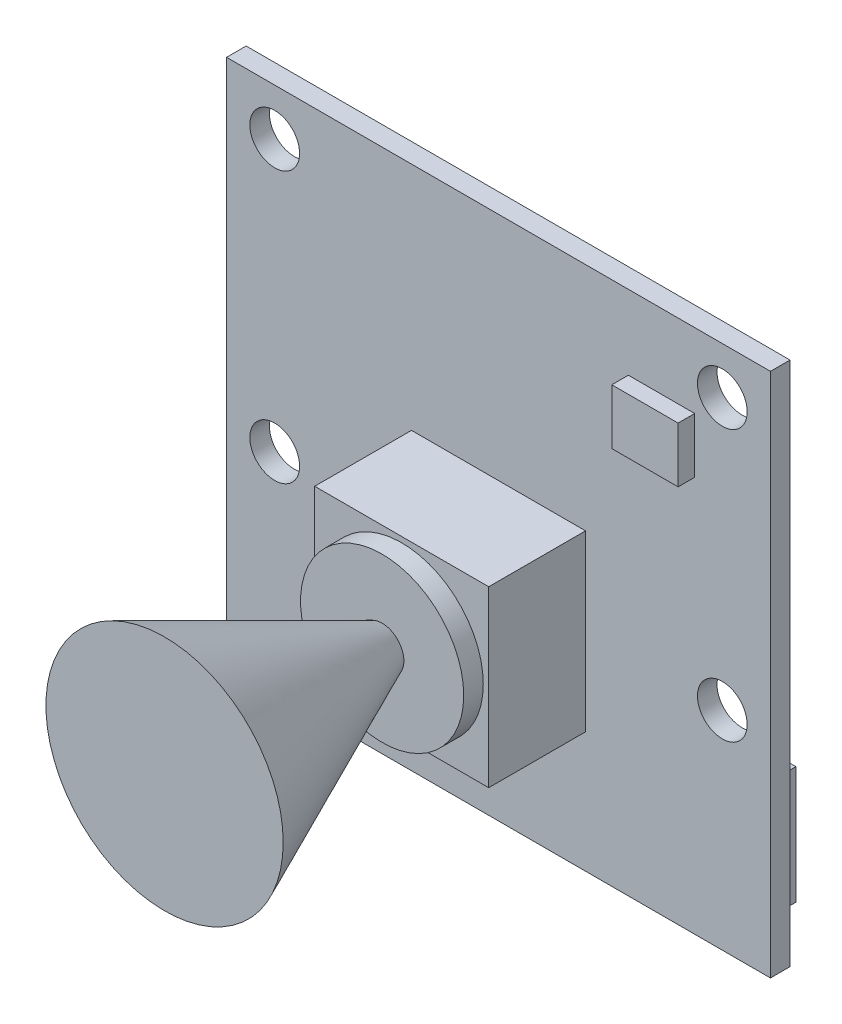
ISO-10303-21;
HEADER;
FILE_DESCRIPTION(('STEP AP214'),'2;1');
FILE_NAME('part.step','',(''),(''),'','','');
FILE_SCHEMA(('AUTOMOTIVE_DESIGN { 1 0 10303 214 1 1 1 1 }'));
ENDSEC;
DATA;
#1=APPLICATION_CONTEXT('core data for automotive mechanical design processes');
#2=APPLICATION_PROTOCOL_DEFINITION('international standard','automotive_design',2000,#1);
#3=PRODUCT_CONTEXT('',#1,'mechanical');
#4=PRODUCT('Part','Part','',(#3));
#5=PRODUCT_RELATED_PRODUCT_CATEGORY('part','',(#4));
#6=PRODUCT_DEFINITION_FORMATION('','',#4);
#7=PRODUCT_DEFINITION_CONTEXT('part definition',#1,'design');
#8=PRODUCT_DEFINITION('design','',#6,#7);
#9=PRODUCT_DEFINITION_SHAPE('','',#8);
#10=(LENGTH_UNIT() NAMED_UNIT(*) SI_UNIT(.MILLI.,.METRE.));
#11=(NAMED_UNIT(*) PLANE_ANGLE_UNIT() SI_UNIT($,.RADIAN.));
#12=(NAMED_UNIT(*) SI_UNIT($,.STERADIAN.) SOLID_ANGLE_UNIT());
#13=UNCERTAINTY_MEASURE_WITH_UNIT(LENGTH_MEASURE(1.E-05),#10,'distance_accuracy_value','');
#14=(GEOMETRIC_REPRESENTATION_CONTEXT(3) GLOBAL_UNCERTAINTY_ASSIGNED_CONTEXT((#13)) GLOBAL_UNIT_ASSIGNED_CONTEXT((#10,
#11,#12)) REPRESENTATION_CONTEXT('',''));
#15=CARTESIAN_POINT('',(0.,0.,0.));
#16=DIRECTION('',(0.,0.,1.));
#17=DIRECTION('',(1.,0.,0.));
#18=AXIS2_PLACEMENT_3D('',#15,#16,#17);
#19=CARTESIAN_POINT('',(0.,0.,0.9));
#20=DIRECTION('',(0.,0.,-1.));
#21=DIRECTION('',(-1.,0.,0.));
#22=AXIS2_PLACEMENT_3D('',#19,#20,#21);
#23=PLANE('',#22);
#24=DIRECTION('',(0.,-1.,0.));
#25=VECTOR('',#24,1.);
#26=CARTESIAN_POINT('',(-4.00000000000001,1.47500000000001,0.9));
#27=LINE('',#26,#25);
#28=CARTESIAN_POINT('',(-4.00000000000001,1.47500000000001,0.9));
#29=VERTEX_POINT('',#28);
#30=CARTESIAN_POINT('',(-4.00000000000001,-6.52499999999999,0.9));
#31=VERTEX_POINT('',#30);
#32=EDGE_CURVE('E646',#29,#31,#27,.T.);
#33=ORIENTED_EDGE('',*,*,#32,.F.);
#34=DIRECTION('',(-1.,0.,0.));
#35=VECTOR('',#34,1.);
#36=CARTESIAN_POINT('',(-4.00000000000001,1.47500000000001,0.9));
#37=LINE('',#36,#35);
#38=CARTESIAN_POINT('',(3.99999999999999,1.47500000000001,0.9));
#39=VERTEX_POINT('',#38);
#40=EDGE_CURVE('E653',#39,#29,#37,.T.);
#41=ORIENTED_EDGE('',*,*,#40,.F.);
#42=DIRECTION('',(0.,1.,0.));
#43=VECTOR('',#42,1.);
#44=CARTESIAN_POINT('',(3.99999999999999,1.47500000000001,0.9));
#45=LINE('',#44,#43);
#46=CARTESIAN_POINT('',(3.99999999999999,-6.52499999999999,0.9));
#47=VERTEX_POINT('',#46);
#48=EDGE_CURVE('E665',#47,#39,#45,.T.);
#49=ORIENTED_EDGE('',*,*,#48,.F.);
#50=DIRECTION('',(1.,0.,0.));
#51=VECTOR('',#50,1.);
#52=CARTESIAN_POINT('',(-4.00000000000001,-6.52499999999999,0.9));
#53=LINE('',#52,#51);
#54=EDGE_CURVE('E662',#31,#47,#53,.T.);
#55=ORIENTED_EDGE('',*,*,#54,.F.);
#56=EDGE_LOOP('',(#33,#41,#49,#55));
#57=FACE_BOUND('',#56,.T.);
#58=DIRECTION('',(0.,-1.,0.));
#59=VECTOR('',#58,1.);
#60=CARTESIAN_POINT('',(-12.5,12.075,0.9));
#61=LINE('',#60,#59);
#62=CARTESIAN_POINT('',(-12.5,12.075,0.9));
#63=VERTEX_POINT('',#62);
#64=CARTESIAN_POINT('',(-12.5,-12.075,0.9));
#65=VERTEX_POINT('',#64);
#66=EDGE_CURVE('E386',#63,#65,#61,.T.);
#67=ORIENTED_EDGE('',*,*,#66,.T.);
#68=DIRECTION('',(1.,0.,0.));
#69=VECTOR('',#68,1.);
#70=CARTESIAN_POINT('',(12.5,-12.075,0.9));
#71=LINE('',#70,#69);
#72=CARTESIAN_POINT('',(12.5,-12.075,0.9));
#73=VERTEX_POINT('',#72);
#74=EDGE_CURVE('E404',#65,#73,#71,.T.);
#75=ORIENTED_EDGE('',*,*,#74,.T.);
#76=DIRECTION('',(0.,1.,0.));
#77=VECTOR('',#76,1.);
#78=CARTESIAN_POINT('',(12.5,12.075,0.9));
#79=LINE('',#78,#77);
#80=CARTESIAN_POINT('',(12.5,12.075,0.9));
#81=VERTEX_POINT('',#80);
#82=EDGE_CURVE('E397',#73,#81,#79,.T.);
#83=ORIENTED_EDGE('',*,*,#82,.T.);
#84=DIRECTION('',(-1.,0.,0.));
#85=VECTOR('',#84,1.);
#86=CARTESIAN_POINT('',(12.5,12.075,0.9));
#87=LINE('',#86,#85);
#88=EDGE_CURVE('E391',#81,#63,#87,.T.);
#89=ORIENTED_EDGE('',*,*,#88,.T.);
#90=EDGE_LOOP('',(#67,#75,#83,#89));
#91=FACE_BOUND('',#90,.T.);
#92=CARTESIAN_POINT('',(-10.287,9.92500000000002,0.9));
#93=DIRECTION('',(0.,0.,1.));
#94=DIRECTION('',(1.,0.,0.));
#95=AXIS2_PLACEMENT_3D('',#92,#93,#94);
#96=CIRCLE('',#95,1.143);
#97=CARTESIAN_POINT('',(-9.144,9.92500000000002,0.9));
#98=VERTEX_POINT('',#97);
#99=EDGE_CURVE('E206',#98,#98,#96,.T.);
#100=ORIENTED_EDGE('',*,*,#99,.F.);
#101=EDGE_LOOP('',(#100));
#102=FACE_BOUND('',#101,.T.);
#103=CARTESIAN_POINT('',(10.287,9.92500000000002,0.9));
#104=DIRECTION('',(0.,0.,1.));
#105=DIRECTION('',(1.,0.,0.));
#106=AXIS2_PLACEMENT_3D('',#103,#104,#105);
#107=CIRCLE('',#106,1.143);
#108=CARTESIAN_POINT('',(11.43,9.92500000000002,0.9));
#109=VERTEX_POINT('',#108);
#110=EDGE_CURVE('E202',#109,#109,#107,.T.);
#111=ORIENTED_EDGE('',*,*,#110,.F.);
#112=EDGE_LOOP('',(#111));
#113=FACE_BOUND('',#112,.T.);
#114=CARTESIAN_POINT('',(10.2870000000005,-2.52099999999998,0.9));
#115=DIRECTION('',(0.,0.,1.));
#116=DIRECTION('',(1.,0.,0.));
#117=AXIS2_PLACEMENT_3D('',#114,#115,#116);
#118=CIRCLE('',#117,1.143);
#119=CARTESIAN_POINT('',(11.4300000000005,-2.52099999999998,0.9));
#120=VERTEX_POINT('',#119);
#121=EDGE_CURVE('E198',#120,#120,#118,.T.);
#122=ORIENTED_EDGE('',*,*,#121,.F.);
#123=EDGE_LOOP('',(#122));
#124=FACE_BOUND('',#123,.T.);
#125=CARTESIAN_POINT('',(-10.2869999999995,-2.52099999999997,0.9));
#126=DIRECTION('',(0.,0.,1.));
#127=DIRECTION('',(1.,0.,0.));
#128=AXIS2_PLACEMENT_3D('',#125,#126,#127);
#129=CIRCLE('',#128,1.143);
#130=CARTESIAN_POINT('',(-9.14399999999952,-2.52099999999997,0.9));
#131=VERTEX_POINT('',#130);
#132=EDGE_CURVE('E190',#131,#131,#129,.T.);
#133=ORIENTED_EDGE('',*,*,#132,.F.);
#134=EDGE_LOOP('',(#133));
#135=FACE_BOUND('',#134,.T.);
#136=DIRECTION('',(0.,1.,0.));
#137=VECTOR('',#136,1.);
#138=CARTESIAN_POINT('',(9.01700000000001,6.11500000000002,0.9));
#139=LINE('',#138,#137);
#140=CARTESIAN_POINT('',(9.01700000000001,6.11500000000002,0.9));
#141=VERTEX_POINT('',#140);
#142=CARTESIAN_POINT('',(9.01700000000001,8.65500000000002,0.9));
#143=VERTEX_POINT('',#142);
#144=EDGE_CURVE('E189',#141,#143,#139,.T.);
#145=ORIENTED_EDGE('',*,*,#144,.F.);
#146=DIRECTION('',(1.,0.,0.));
#147=VECTOR('',#146,1.);
#148=CARTESIAN_POINT('',(9.01700000000001,6.11500000000002,0.9));
#149=LINE('',#148,#147);
#150=CARTESIAN_POINT('',(5.96900000000001,6.11500000000002,0.9));
#151=VERTEX_POINT('',#150);
#152=EDGE_CURVE('E186',#151,#141,#149,.T.);
#153=ORIENTED_EDGE('',*,*,#152,.F.);
#154=DIRECTION('',(0.,-1.,0.));
#155=VECTOR('',#154,1.);
#156=CARTESIAN_POINT('',(5.96900000000001,6.11500000000002,0.9));
#157=LINE('',#156,#155);
#158=CARTESIAN_POINT('',(5.96900000000001,8.65500000000002,0.9));
#159=VERTEX_POINT('',#158);
#160=EDGE_CURVE('E76',#159,#151,#157,.T.);
#161=ORIENTED_EDGE('',*,*,#160,.F.);
#162=DIRECTION('',(-1.,0.,0.));
#163=VECTOR('',#162,1.);
#164=CARTESIAN_POINT('',(9.01700000000001,8.65500000000002,0.9));
#165=LINE('',#164,#163);
#166=EDGE_CURVE('E71',#143,#159,#165,.T.);
#167=ORIENTED_EDGE('',*,*,#166,.F.);
#168=EDGE_LOOP('',(#145,#153,#161,#167));
#169=FACE_BOUND('',#168,.T.);
#170=ADVANCED_FACE('F54',(#57,#91,#102,#113,#124,#135,#169),#23,.F.);
#171=CARTESIAN_POINT('',(0.,-2.52499999999999,6.25));
#172=DIRECTION('',(0.,0.,1.));
#173=DIRECTION('',(1.,0.,0.));
#174=AXIS2_PLACEMENT_3D('',#171,#172,#173);
#175=PLANE('',#174);
#176=CARTESIAN_POINT('',(0.,-2.52499999999999,6.25));
#177=DIRECTION('',(0.,0.,1.));
#178=DIRECTION('',(1.,0.,0.));
#179=AXIS2_PLACEMENT_3D('',#176,#177,#178);
#180=CIRCLE('',#179,3.75);
#181=CARTESIAN_POINT('',(3.74999999999999,-2.52499999999999,6.25));
#182=VERTEX_POINT('',#181);
#183=EDGE_CURVE('E643',#182,#182,#180,.T.);
#184=ORIENTED_EDGE('',*,*,#183,.T.);
#185=EDGE_LOOP('',(#184));
#186=FACE_BOUND('',#185,.T.);
#187=CARTESIAN_POINT('',(-1.00000000000001,-2.52499999999999,6.25));
#188=CARTESIAN_POINT('',(-0.999996306994965,-2.46893499550475,6.25));
#189=CARTESIAN_POINT('',(-0.995350622196305,-2.41282762119064,6.25));
#190=CARTESIAN_POINT('',(-0.976661927148961,-2.30216098638151,6.25));
#191=CARTESIAN_POINT('',(-0.962610716278052,-2.24760312020311,6.25));
#192=CARTESIAN_POINT('',(-0.925508351376268,-2.14170667745026,6.25));
#193=CARTESIAN_POINT('',(-0.902467465794685,-2.09036450512899,6.25));
#194=CARTESIAN_POINT('',(-0.848058068879219,-1.99218539502379,6.25));
#195=CARTESIAN_POINT('',(-0.816674564418837,-1.94535677741744,6.25));
#196=CARTESIAN_POINT('',(-0.74653534628725,-1.85757712425992,6.25));
#197=CARTESIAN_POINT('',(-0.707777979460206,-1.81662741032686,6.25));
#198=CARTESIAN_POINT('',(-0.624058099402262,-1.74181622803023,6.25));
#199=CARTESIAN_POINT('',(-0.579106389450858,-1.70794267174781,6.25));
#200=CARTESIAN_POINT('',(-0.483750278218312,-1.6479248133205,6.25));
#201=CARTESIAN_POINT('',(-0.433301535903738,-1.62185086332074,6.25));
#202=CARTESIAN_POINT('',(-0.328702129475173,-1.57866080582758,6.25));
#203=CARTESIAN_POINT('',(-0.274551664243998,-1.56154421750817,6.25));
#204=CARTESIAN_POINT('',(-0.164781358807762,-1.53694853461237,6.25));
#205=CARTESIAN_POINT('',(-0.109186171138399,-1.52935886184247,6.25));
#206=CARTESIAN_POINT('',(0.00249802410029693,-1.52344386541205,6.25));
#207=CARTESIAN_POINT('',(0.0585871084118823,-1.52512000778215,6.25));
#208=CARTESIAN_POINT('',(0.170318702083456,-1.53786206881477,6.25));
#209=CARTESIAN_POINT('',(0.225949739378718,-1.54902980285331,6.25));
#210=CARTESIAN_POINT('',(0.334479304909576,-1.58068768357958,6.25));
#211=CARTESIAN_POINT('',(0.38737850996566,-1.60117550872553,6.25));
#212=CARTESIAN_POINT('',(0.488308954947386,-1.65050382307394,6.25));
#213=CARTESIAN_POINT('',(0.536392220048153,-1.67923809637645,6.25));
#214=CARTESIAN_POINT('',(0.627201871156826,-1.74434332804429,6.25));
#215=CARTESIAN_POINT('',(0.669918618627324,-1.78072772180188,6.25));
#216=CARTESIAN_POINT('',(0.749114694049686,-1.86045127580089,6.25));
#217=CARTESIAN_POINT('',(0.785530298805205,-1.90385376633376,6.25));
#218=CARTESIAN_POINT('',(0.850502101497384,-1.99607766888967,6.25));
#219=CARTESIAN_POINT('',(0.879071983385435,-2.04488943496862,6.25));
#220=CARTESIAN_POINT('',(0.927580043556275,-2.1466955786334,6.25));
#221=CARTESIAN_POINT('',(0.947509466939668,-2.19969413449917,6.25));
#222=CARTESIAN_POINT('',(0.978057662728628,-2.30832114704335,6.25));
#223=CARTESIAN_POINT('',(0.988674287085743,-2.36395020734535,6.25));
#224=CARTESIAN_POINT('',(1.00036731884419,-2.47563359029439,6.25));
#225=CARTESIAN_POINT('',(1.00153705369049,-2.53167826375401,6.25));
#226=CARTESIAN_POINT('',(0.994620413523798,-2.64319033453264,6.25));
#227=CARTESIAN_POINT('',(0.986535643532167,-2.69865783026903,6.25));
#228=CARTESIAN_POINT('',(0.96097929269167,-2.80809122999947,6.25));
#229=CARTESIAN_POINT('',(0.943397402900872,-2.86203148674256,6.25));
#230=CARTESIAN_POINT('',(0.899331060245317,-2.96614121152984,6.25));
#231=CARTESIAN_POINT('',(0.872846045806734,-3.0163104414683,6.25));
#232=CARTESIAN_POINT('',(0.812134009896514,-3.11095847371733,6.25));
#233=CARTESIAN_POINT('',(0.777992685738152,-3.15549232277643,6.25));
#234=CARTESIAN_POINT('',(0.70280326938518,-3.2382880897712,6.25));
#235=CARTESIAN_POINT('',(0.661754966280285,-3.27654981611198,6.25));
#236=CARTESIAN_POINT('',(0.573354892961709,-3.34613980725396,6.25));
#237=CARTESIAN_POINT('',(0.5259345552187,-3.37738107330094,6.25));
#238=CARTESIAN_POINT('',(0.426500332278462,-3.43138297577567,6.25));
#239=CARTESIAN_POINT('',(0.374487693527669,-3.45414590470118,6.25));
#240=CARTESIAN_POINT('',(0.267747377340753,-3.49033683046368,6.25));
#241=CARTESIAN_POINT('',(0.213043186642256,-3.50383406845142,6.25));
#242=CARTESIAN_POINT('',(0.102135047389826,-3.52142623246307,6.25));
#243=CARTESIAN_POINT('',(0.0459305897118959,-3.5255179245493,6.25));
#244=CARTESIAN_POINT('',(-0.0664434628607701,-3.52437883063078,6.25));
#245=CARTESIAN_POINT('',(-0.122612960919627,-3.51913835787382,6.25));
#246=CARTESIAN_POINT('',(-0.23324797888165,-3.49923781438483,6.25));
#247=CARTESIAN_POINT('',(-0.287714108369473,-3.48458115483023,6.25));
#248=CARTESIAN_POINT('',(-0.393314242660882,-3.44628840411159,6.25));
#249=CARTESIAN_POINT('',(-0.444452139636769,-3.42266303069248,6.25));
#250=CARTESIAN_POINT('',(-0.542049700017669,-3.36716609083734,6.25));
#251=CARTESIAN_POINT('',(-0.588508225875332,-3.3352925259689,6.25));
#252=CARTESIAN_POINT('',(-0.675484093255291,-3.2642418146366,6.25));
#253=CARTESIAN_POINT('',(-0.715999082307131,-3.2250617901135,6.25));
#254=CARTESIAN_POINT('',(-0.789941009538081,-3.14050354115835,6.25));
#255=CARTESIAN_POINT('',(-0.823368256352866,-3.09512558675664,6.25));
#256=CARTESIAN_POINT('',(-0.882385176044294,-2.99903106093783,6.25));
#257=CARTESIAN_POINT('',(-0.907910462738526,-2.94827493494494,6.25));
#258=CARTESIAN_POINT('',(-0.949919874340684,-2.84320184102994,6.25));
#259=CARTESIAN_POINT('',(-0.966415862319407,-2.78888965082777,6.25));
#260=CARTESIAN_POINT('',(-0.985454454021836,-2.6993484569695,6.25));
#261=CARTESIAN_POINT('',(-0.990917483215469,-2.66471303557232,6.25));
#262=CARTESIAN_POINT('',(-0.998191720994227,-2.59505730152406,6.25));
#263=CARTESIAN_POINT('',(-1.00000230788421,-2.56003692436812,6.25));
#264=CARTESIAN_POINT('',(-1.00000000000001,-2.52499999999999,6.25));
#265=B_SPLINE_CURVE_WITH_KNOTS('',3,(#187,#188,#189,#190,#191,#192,#193,#194,#195,#196,#197,
#198,#199,#200,#201,#202,#203,#204,#205,#206,#207,#208,#209,#210,#211,#212,#213,#214,#215,#216,
#217,#218,#219,#220,#221,#222,#223,#224,#225,#226,#227,#228,#229,#230,#231,#232,#233,#234,#235,
#236,#237,#238,#239,#240,#241,#242,#243,#244,#245,#246,#247,#248,#249,#250,#251,#252,#253,#254,
#255,#256,#257,#258,#259,#260,#261,#262,#263,#264),.UNSPECIFIED.,.T.,.F.,(4,2,2,2,2,2,2,2,2,2,2,
2,2,2,2,2,2,2,2,2,2,2,2,2,2,2,2,2,2,2,2,2,2,2,2,2,2,2,4),(0.,0.16806481134177,0.336276348592942,
0.504296306217517,0.672620290457807,0.840982056034648,1.00905382055622,1.17859879243335,
1.34813466230021,1.51568397790197,1.68325980379473,1.85265622139595,2.02201046712321,
2.18927441823616,2.3568346148147,2.52600118570525,2.69487080683166,2.86391113658914,
3.03299044618626,3.20039732340819,3.36777517142616,3.53714027900402,3.70651607146694,
3.87408309899501,4.04165524424901,4.2112016686703,4.38070221529105,4.54892190246147,
4.71719942047655,4.88565171175275,5.05404301264137,5.22223371369207,5.39046520343676,
5.55876310111044,5.72705366874785,5.8966814382409,6.06608580542762,6.17109733791551,
6.27612674328061),.UNSPECIFIED.);
#266=CARTESIAN_POINT('',(0.999999999999994,-2.52499999999999,6.25));
#267=VERTEX_POINT('',#266);
#268=EDGE_CURVE('E306',#267,#267,#265,.F.);
#269=ORIENTED_EDGE('',*,*,#268,.F.);
#270=EDGE_LOOP('',(#269));
#271=FACE_BOUND('',#270,.T.);
#272=ADVANCED_FACE('F316',(#186,#271),#175,.T.);
#273=CARTESIAN_POINT('',(0.,0.,5.35));
#274=DIRECTION('',(0.,0.,1.));
#275=DIRECTION('',(1.,0.,0.));
#276=AXIS2_PLACEMENT_3D('',#273,#274,#275);
#277=PLANE('',#276);
#278=DIRECTION('',(0.,-1.,0.));
#279=VECTOR('',#278,1.);
#280=CARTESIAN_POINT('',(-4.00000000000001,1.47500000000001,5.35));
#281=LINE('',#280,#279);
#282=CARTESIAN_POINT('',(-4.00000000000001,1.47500000000001,5.35));
#283=VERTEX_POINT('',#282);
#284=CARTESIAN_POINT('',(-4.00000000000001,-6.52499999999999,5.35));
#285=VERTEX_POINT('',#284);
#286=EDGE_CURVE('E649',#283,#285,#281,.T.);
#287=ORIENTED_EDGE('',*,*,#286,.T.);
#288=DIRECTION('',(1.,0.,0.));
#289=VECTOR('',#288,1.);
#290=CARTESIAN_POINT('',(-4.00000000000001,-6.52499999999999,5.35));
#291=LINE('',#290,#289);
#292=CARTESIAN_POINT('',(3.99999999999999,-6.52499999999999,5.35));
#293=VERTEX_POINT('',#292);
#294=EDGE_CURVE('E652',#285,#293,#291,.T.);
#295=ORIENTED_EDGE('',*,*,#294,.T.);
#296=DIRECTION('',(0.,1.,0.));
#297=VECTOR('',#296,1.);
#298=CARTESIAN_POINT('',(3.99999999999999,1.47500000000001,5.35));
#299=LINE('',#298,#297);
#300=CARTESIAN_POINT('',(3.99999999999999,1.47500000000001,5.35));
#301=VERTEX_POINT('',#300);
#302=EDGE_CURVE('E655',#293,#301,#299,.T.);
#303=ORIENTED_EDGE('',*,*,#302,.T.);
#304=DIRECTION('',(-1.,0.,0.));
#305=VECTOR('',#304,1.);
#306=CARTESIAN_POINT('',(-4.00000000000001,1.47500000000001,5.35));
#307=LINE('',#306,#305);
#308=EDGE_CURVE('E657',#301,#283,#307,.T.);
#309=ORIENTED_EDGE('',*,*,#308,.T.);
#310=EDGE_LOOP('',(#287,#295,#303,#309));
#311=FACE_BOUND('',#310,.T.);
#312=CARTESIAN_POINT('',(0.,-2.52499999999999,5.35));
#313=DIRECTION('',(0.,0.,1.));
#314=DIRECTION('',(1.,0.,0.));
#315=AXIS2_PLACEMENT_3D('',#312,#313,#314);
#316=CIRCLE('',#315,3.75);
#317=CARTESIAN_POINT('',(3.74999999999999,-2.52499999999999,5.35));
#318=VERTEX_POINT('',#317);
#319=EDGE_CURVE('E311',#318,#318,#316,.T.);
#320=ORIENTED_EDGE('',*,*,#319,.F.);
#321=EDGE_LOOP('',(#320));
#322=FACE_BOUND('',#321,.T.);
#323=ADVANCED_FACE('F320',(#311,#322),#277,.T.);
#324=CARTESIAN_POINT('',(-12.5,12.075,0.9));
#325=DIRECTION('',(1.,0.,0.));
#326=DIRECTION('',(0.,1.,0.));
#327=AXIS2_PLACEMENT_3D('',#324,#325,#326);
#328=PLANE('',#327);
#329=DIRECTION('',(0.,-1.,0.));
#330=VECTOR('',#329,1.);
#331=CARTESIAN_POINT('',(-12.5,12.075,0.));
#332=LINE('',#331,#330);
#333=CARTESIAN_POINT('',(-12.5,12.075,0.));
#334=VERTEX_POINT('',#333);
#335=CARTESIAN_POINT('',(-12.5,-12.075,0.));
#336=VERTEX_POINT('',#335);
#337=EDGE_CURVE('E377',#334,#336,#332,.T.);
#338=ORIENTED_EDGE('',*,*,#337,.T.);
#339=DIRECTION('',(0.,0.,-1.));
#340=VECTOR('',#339,1.);
#341=CARTESIAN_POINT('',(-12.5,-12.075,0.9));
#342=LINE('',#341,#340);
#343=EDGE_CURVE('E13',#65,#336,#342,.T.);
#344=ORIENTED_EDGE('',*,*,#343,.F.);
#345=ORIENTED_EDGE('',*,*,#66,.F.);
#346=DIRECTION('',(0.,0.,-1.));
#347=VECTOR('',#346,1.);
#348=CARTESIAN_POINT('',(-12.5,12.075,0.9));
#349=LINE('',#348,#347);
#350=EDGE_CURVE('E387',#63,#334,#349,.T.);
#351=ORIENTED_EDGE('',*,*,#350,.T.);
#352=EDGE_LOOP('',(#338,#344,#345,#351));
#353=FACE_BOUND('',#352,.T.);
#354=ADVANCED_FACE('F56',(#353),#328,.F.);
#355=CARTESIAN_POINT('',(12.5,-12.075,0.9));
#356=DIRECTION('',(0.,1.,0.));
#357=DIRECTION('',(-1.,0.,0.));
#358=AXIS2_PLACEMENT_3D('',#355,#356,#357);
#359=PLANE('',#358);
#360=DIRECTION('',(1.,0.,0.));
#361=VECTOR('',#360,1.);
#362=CARTESIAN_POINT('',(12.5,-12.075,0.));
#363=LINE('',#362,#361);
#364=CARTESIAN_POINT('',(-10.08,-12.075,0.));
#365=VERTEX_POINT('',#364);
#366=EDGE_CURVE('E313',#336,#365,#363,.T.);
#367=ORIENTED_EDGE('',*,*,#366,.T.);
#368=DIRECTION('',(0.,0.,1.));
#369=VECTOR('',#368,1.);
#370=CARTESIAN_POINT('',(-10.08,-12.075,-2.7));
#371=LINE('',#370,#369);
#372=CARTESIAN_POINT('',(-10.08,-12.075,-2.7));
#373=VERTEX_POINT('',#372);
#374=EDGE_CURVE('E269',#373,#365,#371,.T.);
#375=ORIENTED_EDGE('',*,*,#374,.F.);
#376=DIRECTION('',(-1.,0.,0.));
#377=VECTOR('',#376,1.);
#378=CARTESIAN_POINT('',(10.07,-12.075,-2.7));
#379=LINE('',#378,#377);
#380=CARTESIAN_POINT('',(10.07,-12.075,-2.7));
#381=VERTEX_POINT('',#380);
#382=EDGE_CURVE('E213',#381,#373,#379,.T.);
#383=ORIENTED_EDGE('',*,*,#382,.F.);
#384=DIRECTION('',(0.,0.,1.));
#385=VECTOR('',#384,1.);
#386=CARTESIAN_POINT('',(10.07,-12.075,-2.7));
#387=LINE('',#386,#385);
#388=CARTESIAN_POINT('',(10.07,-12.075,0.));
#389=VERTEX_POINT('',#388);
#390=EDGE_CURVE('E370',#381,#389,#387,.T.);
#391=ORIENTED_EDGE('',*,*,#390,.T.);
#392=CARTESIAN_POINT('',(12.5,-12.075,0.));
#393=VERTEX_POINT('',#392);
#394=EDGE_CURVE('E255',#389,#393,#363,.T.);
#395=ORIENTED_EDGE('',*,*,#394,.T.);
#396=DIRECTION('',(0.,0.,-1.));
#397=VECTOR('',#396,1.);
#398=CARTESIAN_POINT('',(12.5,-12.075,0.9));
#399=LINE('',#398,#397);
#400=EDGE_CURVE('E63',#73,#393,#399,.T.);
#401=ORIENTED_EDGE('',*,*,#400,.F.);
#402=ORIENTED_EDGE('',*,*,#74,.F.);
#403=ORIENTED_EDGE('',*,*,#343,.T.);
#404=EDGE_LOOP('',(#367,#375,#383,#391,#395,#401,#402,#403));
#405=FACE_BOUND('',#404,.T.);
#406=ADVANCED_FACE('F352',(#405),#359,.F.);
#407=CARTESIAN_POINT('',(12.5,12.075,0.9));
#408=DIRECTION('',(-1.,0.,0.));
#409=DIRECTION('',(0.,-1.,0.));
#410=AXIS2_PLACEMENT_3D('',#407,#408,#409);
#411=PLANE('',#410);
#412=DIRECTION('',(0.,1.,0.));
#413=VECTOR('',#412,1.);
#414=CARTESIAN_POINT('',(12.5,12.075,0.));
#415=LINE('',#414,#413);
#416=CARTESIAN_POINT('',(12.5,12.075,0.));
#417=VERTEX_POINT('',#416);
#418=EDGE_CURVE('E367',#393,#417,#415,.T.);
#419=ORIENTED_EDGE('',*,*,#418,.T.);
#420=DIRECTION('',(0.,0.,-1.));
#421=VECTOR('',#420,1.);
#422=CARTESIAN_POINT('',(12.5,12.075,0.9));
#423=LINE('',#422,#421);
#424=EDGE_CURVE('E390',#81,#417,#423,.T.);
#425=ORIENTED_EDGE('',*,*,#424,.F.);
#426=ORIENTED_EDGE('',*,*,#82,.F.);
#427=ORIENTED_EDGE('',*,*,#400,.T.);
#428=EDGE_LOOP('',(#419,#425,#426,#427));
#429=FACE_BOUND('',#428,.T.);
#430=ADVANCED_FACE('F349',(#429),#411,.F.);
#431=CARTESIAN_POINT('',(12.5,12.075,0.9));
#432=DIRECTION('',(0.,-1.,0.));
#433=DIRECTION('',(1.,0.,0.));
#434=AXIS2_PLACEMENT_3D('',#431,#432,#433);
#435=PLANE('',#434);
#436=DIRECTION('',(-1.,0.,0.));
#437=VECTOR('',#436,1.);
#438=CARTESIAN_POINT('',(12.5,12.075,0.));
#439=LINE('',#438,#437);
#440=EDGE_CURVE('E384',#417,#334,#439,.T.);
#441=ORIENTED_EDGE('',*,*,#440,.T.);
#442=ORIENTED_EDGE('',*,*,#350,.F.);
#443=ORIENTED_EDGE('',*,*,#88,.F.);
#444=ORIENTED_EDGE('',*,*,#424,.T.);
#445=EDGE_LOOP('',(#441,#442,#443,#444));
#446=FACE_BOUND('',#445,.T.);
#447=ADVANCED_FACE('F245',(#446),#435,.F.);
#448=CARTESIAN_POINT('',(0.,0.,0.));
#449=DIRECTION('',(0.,0.,-1.));
#450=DIRECTION('',(-1.,0.,0.));
#451=AXIS2_PLACEMENT_3D('',#448,#449,#450);
#452=PLANE('',#451);
#453=CARTESIAN_POINT('',(-10.2869999999995,-2.52099999999997,0.));
#454=DIRECTION('',(0.,0.,-1.));
#455=DIRECTION('',(-1.,0.,0.));
#456=AXIS2_PLACEMENT_3D('',#453,#454,#455);
#457=CIRCLE('',#456,1.143);
#458=CARTESIAN_POINT('',(-11.4299999999995,-2.52099999999997,0.));
#459=VERTEX_POINT('',#458);
#460=EDGE_CURVE('E58',#459,#459,#457,.T.);
#461=ORIENTED_EDGE('',*,*,#460,.F.);
#462=EDGE_LOOP('',(#461));
#463=FACE_BOUND('',#462,.T.);
#464=CARTESIAN_POINT('',(10.2870000000005,-2.52099999999998,0.));
#465=DIRECTION('',(0.,0.,-1.));
#466=DIRECTION('',(-1.,0.,0.));
#467=AXIS2_PLACEMENT_3D('',#464,#465,#466);
#468=CIRCLE('',#467,1.143);
#469=CARTESIAN_POINT('',(9.14400000000049,-2.52099999999998,0.));
#470=VERTEX_POINT('',#469);
#471=EDGE_CURVE('E201',#470,#470,#468,.T.);
#472=ORIENTED_EDGE('',*,*,#471,.F.);
#473=EDGE_LOOP('',(#472));
#474=FACE_BOUND('',#473,.T.);
#475=CARTESIAN_POINT('',(10.287,9.92500000000002,0.));
#476=DIRECTION('',(0.,0.,-1.));
#477=DIRECTION('',(-1.,0.,0.));
#478=AXIS2_PLACEMENT_3D('',#475,#476,#477);
#479=CIRCLE('',#478,1.143);
#480=CARTESIAN_POINT('',(9.144,9.92500000000002,0.));
#481=VERTEX_POINT('',#480);
#482=EDGE_CURVE('E205',#481,#481,#479,.T.);
#483=ORIENTED_EDGE('',*,*,#482,.F.);
#484=EDGE_LOOP('',(#483));
#485=FACE_BOUND('',#484,.T.);
#486=CARTESIAN_POINT('',(-10.287,9.92500000000002,0.));
#487=DIRECTION('',(0.,0.,-1.));
#488=DIRECTION('',(-1.,0.,0.));
#489=AXIS2_PLACEMENT_3D('',#486,#487,#488);
#490=CIRCLE('',#489,1.143);
#491=CARTESIAN_POINT('',(-11.43,9.92500000000002,0.));
#492=VERTEX_POINT('',#491);
#493=EDGE_CURVE('E209',#492,#492,#490,.T.);
#494=ORIENTED_EDGE('',*,*,#493,.F.);
#495=EDGE_LOOP('',(#494));
#496=FACE_BOUND('',#495,.T.);
#497=DIRECTION('',(0.,-1.,0.));
#498=VECTOR('',#497,1.);
#499=CARTESIAN_POINT('',(10.07,-6.67499999999999,0.));
#500=LINE('',#499,#498);
#501=CARTESIAN_POINT('',(10.07,-6.67499999999999,0.));
#502=VERTEX_POINT('',#501);
#503=EDGE_CURVE('E225',#502,#389,#500,.T.);
#504=ORIENTED_EDGE('',*,*,#503,.F.);
#505=DIRECTION('',(1.,0.,0.));
#506=VECTOR('',#505,1.);
#507=CARTESIAN_POINT('',(10.07,-6.67499999999999,0.));
#508=LINE('',#507,#506);
#509=CARTESIAN_POINT('',(-10.08,-6.67499999999999,0.));
#510=VERTEX_POINT('',#509);
#511=EDGE_CURVE('E214',#510,#502,#508,.T.);
#512=ORIENTED_EDGE('',*,*,#511,.F.);
#513=DIRECTION('',(0.,1.,0.));
#514=VECTOR('',#513,1.);
#515=CARTESIAN_POINT('',(-10.08,-6.67499999999999,0.));
#516=LINE('',#515,#514);
#517=EDGE_CURVE('E229',#365,#510,#516,.T.);
#518=ORIENTED_EDGE('',*,*,#517,.F.);
#519=ORIENTED_EDGE('',*,*,#366,.F.);
#520=ORIENTED_EDGE('',*,*,#337,.F.);
#521=ORIENTED_EDGE('',*,*,#440,.F.);
#522=ORIENTED_EDGE('',*,*,#418,.F.);
#523=ORIENTED_EDGE('',*,*,#394,.F.);
#524=EDGE_LOOP('',(#504,#512,#518,#519,#520,#521,#522,#523));
#525=FACE_BOUND('',#524,.T.);
#526=ADVANCED_FACE('F241',(#463,#474,#485,#496,#525),#452,.T.);
#527=CARTESIAN_POINT('',(-4.00000000000001,1.47500000000001,5.35));
#528=DIRECTION('',(1.,0.,0.));
#529=DIRECTION('',(0.,1.,0.));
#530=AXIS2_PLACEMENT_3D('',#527,#528,#529);
#531=PLANE('',#530);
#532=ORIENTED_EDGE('',*,*,#32,.T.);
#533=DIRECTION('',(0.,0.,-1.));
#534=VECTOR('',#533,1.);
#535=CARTESIAN_POINT('',(-4.00000000000001,-6.52499999999999,5.35));
#536=LINE('',#535,#534);
#537=EDGE_CURVE('E408',#285,#31,#536,.T.);
#538=ORIENTED_EDGE('',*,*,#537,.F.);
#539=ORIENTED_EDGE('',*,*,#286,.F.);
#540=DIRECTION('',(0.,0.,-1.));
#541=VECTOR('',#540,1.);
#542=CARTESIAN_POINT('',(-4.00000000000001,1.47500000000001,5.35));
#543=LINE('',#542,#541);
#544=EDGE_CURVE('E659',#283,#29,#543,.T.);
#545=ORIENTED_EDGE('',*,*,#544,.T.);
#546=EDGE_LOOP('',(#532,#538,#539,#545));
#547=FACE_BOUND('',#546,.T.);
#548=ADVANCED_FACE('F244',(#547),#531,.F.);
#549=CARTESIAN_POINT('',(-4.00000000000001,-6.52499999999999,5.35));
#550=DIRECTION('',(0.,1.,0.));
#551=DIRECTION('',(-1.,0.,0.));
#552=AXIS2_PLACEMENT_3D('',#549,#550,#551);
#553=PLANE('',#552);
#554=ORIENTED_EDGE('',*,*,#54,.T.);
#555=DIRECTION('',(0.,0.,-1.));
#556=VECTOR('',#555,1.);
#557=CARTESIAN_POINT('',(3.99999999999999,-6.52499999999999,5.35));
#558=LINE('',#557,#556);
#559=EDGE_CURVE('E674',#293,#47,#558,.T.);
#560=ORIENTED_EDGE('',*,*,#559,.F.);
#561=ORIENTED_EDGE('',*,*,#294,.F.);
#562=ORIENTED_EDGE('',*,*,#537,.T.);
#563=EDGE_LOOP('',(#554,#560,#561,#562));
#564=FACE_BOUND('',#563,.T.);
#565=ADVANCED_FACE('F336',(#564),#553,.F.);
#566=CARTESIAN_POINT('',(3.99999999999999,1.47500000000001,5.35));
#567=DIRECTION('',(-1.,0.,0.));
#568=DIRECTION('',(0.,0.,1.));
#569=AXIS2_PLACEMENT_3D('',#566,#567,#568);
#570=PLANE('',#569);
#571=ORIENTED_EDGE('',*,*,#48,.T.);
#572=DIRECTION('',(0.,0.,-1.));
#573=VECTOR('',#572,1.);
#574=CARTESIAN_POINT('',(3.99999999999999,1.47500000000001,5.35));
#575=LINE('',#574,#573);
#576=EDGE_CURVE('E672',#301,#39,#575,.T.);
#577=ORIENTED_EDGE('',*,*,#576,.F.);
#578=ORIENTED_EDGE('',*,*,#302,.F.);
#579=ORIENTED_EDGE('',*,*,#559,.T.);
#580=EDGE_LOOP('',(#571,#577,#578,#579));
#581=FACE_BOUND('',#580,.T.);
#582=ADVANCED_FACE('F332',(#581),#570,.F.);
#583=CARTESIAN_POINT('',(-4.00000000000001,1.47500000000001,5.35));
#584=DIRECTION('',(0.,-1.,0.));
#585=DIRECTION('',(0.,0.,-1.));
#586=AXIS2_PLACEMENT_3D('',#583,#584,#585);
#587=PLANE('',#586);
#588=ORIENTED_EDGE('',*,*,#40,.T.);
#589=ORIENTED_EDGE('',*,*,#544,.F.);
#590=ORIENTED_EDGE('',*,*,#308,.F.);
#591=ORIENTED_EDGE('',*,*,#576,.T.);
#592=EDGE_LOOP('',(#588,#589,#590,#591));
#593=FACE_BOUND('',#592,.T.);
#594=ADVANCED_FACE('F325',(#593),#587,.F.);
#595=CARTESIAN_POINT('',(0.,-2.52499999999999,6.25));
#596=DIRECTION('',(0.,0.,-1.));
#597=DIRECTION('',(-1.,0.,0.));
#598=AXIS2_PLACEMENT_3D('',#595,#596,#597);
#599=CYLINDRICAL_SURFACE('',#598,3.75);
#600=ORIENTED_EDGE('',*,*,#183,.F.);
#601=EDGE_LOOP('',(#600));
#602=FACE_BOUND('',#601,.T.);
#603=ORIENTED_EDGE('',*,*,#319,.T.);
#604=EDGE_LOOP('',(#603));
#605=FACE_BOUND('',#604,.T.);
#606=ADVANCED_FACE('F322',(#602,#605),#599,.T.);
#607=CARTESIAN_POINT('',(0.,-2.52499999999999,16.25));
#608=DIRECTION('',(0.,0.,1.));
#609=DIRECTION('',(1.,0.,0.));
#610=AXIS2_PLACEMENT_3D('',#607,#608,#609);
#611=PLANE('',#610);
#612=CARTESIAN_POINT('',(0.,-2.52499999999999,16.25));
#613=DIRECTION('',(0.,0.,1.));
#614=DIRECTION('',(1.,0.,0.));
#615=AXIS2_PLACEMENT_3D('',#612,#613,#614);
#616=CIRCLE('',#615,5.45332960127772);
#617=CARTESIAN_POINT('',(5.45332960127771,-2.52499999999999,16.25));
#618=VERTEX_POINT('',#617);
#619=EDGE_CURVE('E276',#618,#618,#616,.T.);
#620=ORIENTED_EDGE('',*,*,#619,.T.);
#621=EDGE_LOOP('',(#620));
#622=FACE_BOUND('',#621,.T.);
#623=ADVANCED_FACE('F294',(#622),#611,.T.);
#624=CARTESIAN_POINT('',(0.999999999999994,-2.52499999999999,6.25));
#625=CARTESIAN_POINT('',(2.4844432004259,-2.52499999999999,9.58333333333333));
#626=CARTESIAN_POINT('',(3.96888640085181,-2.52499999999999,12.9166666666667));
#627=CARTESIAN_POINT('',(5.45332960127771,-2.52499999999999,16.25));
#628=CARTESIAN_POINT('',(0.999999999999994,-2.49740424950383,6.25));
#629=CARTESIAN_POINT('',(2.4844432004259,-2.45643992531916,9.58333333333333));
#630=CARTESIAN_POINT('',(3.96888640085181,-2.4154756011345,12.9166666666667));
#631=CARTESIAN_POINT('',(5.45332960127771,-2.37451127694983,16.25));
#632=CARTESIAN_POINT('',(0.997759575049609,-2.44273189861075,6.25));
#633=CARTESIAN_POINT('',(2.47887699189185,-2.32060957489156,9.58333333333333));
#634=CARTESIAN_POINT('',(3.9599944087341,-2.19848725117236,12.9166666666667));
#635=CARTESIAN_POINT('',(5.44111182557634,-2.07636492745316,16.25));
#636=CARTESIAN_POINT('',(0.987935854000552,-2.3625390137965,6.25));
#637=CARTESIAN_POINT('',(2.45447051492864,-2.12137490749225,9.58333333333333));
#638=CARTESIAN_POINT('',(3.92100517585673,-1.880210801188,12.9166666666667));
#639=CARTESIAN_POINT('',(5.38753983678482,-1.63904669488374,16.25));
#640=CARTESIAN_POINT('',(0.971907240555687,-2.28441996173529,6.25));
#641=CARTESIAN_POINT('',(2.41464833524329,-1.92729255977505,9.58333333333333));
#642=CARTESIAN_POINT('',(3.8573894299309,-1.57016515781481,12.9166666666667));
#643=CARTESIAN_POINT('',(5.3001305246185,-1.21303775585457,16.25));
#644=CARTESIAN_POINT('',(0.840055352877692,-1.82969779325228,6.25));
#645=CARTESIAN_POINT('',(2.08706980943838,-0.797561160204515,9.58333333333333));
#646=CARTESIAN_POINT('',(3.33408426599906,0.234575472843249,12.9166666666667));
#647=CARTESIAN_POINT('',(4.58109872255975,1.26671210589101,16.25));
#648=CARTESIAN_POINT('',(0.441532007938474,-1.52499999999999,6.25));
#649=CARTESIAN_POINT('',(1.09696119489315,-0.0405567995740794,9.58333333333333));
#650=CARTESIAN_POINT('',(1.75239038184782,1.44388640085183,12.9166666666667));
#651=CARTESIAN_POINT('',(2.4078195688025,2.92832960127773,16.25));
#652=CARTESIAN_POINT('',(-0.551915009923106,-1.52499999999999,6.25));
#653=CARTESIAN_POINT('',(-1.37120149361645,-0.0405567995740794,9.58333333333333));
#654=CARTESIAN_POINT('',(-2.19048797730979,1.44388640085183,12.9166666666667));
#655=CARTESIAN_POINT('',(-3.00977446100313,2.92832960127773,16.25));
#656=CARTESIAN_POINT('',(-1.00000000000001,-1.97308499007689,6.25));
#657=CARTESIAN_POINT('',(-2.48444320042591,-1.15379850638354,9.58333333333333));
#658=CARTESIAN_POINT('',(-3.96888640085182,-0.3345120226902,12.9166666666667));
#659=CARTESIAN_POINT('',(-5.45332960127773,0.484774461003143,16.25));
#660=CARTESIAN_POINT('',(-1.00000000000001,-3.07691500992309,6.25));
#661=CARTESIAN_POINT('',(-2.48444320042591,-3.89620149361643,9.58333333333333));
#662=CARTESIAN_POINT('',(-3.96888640085182,-4.71548797730977,12.9166666666667));
#663=CARTESIAN_POINT('',(-5.45332960127773,-5.53477446100312,16.25));
#664=CARTESIAN_POINT('',(-0.551915009923107,-3.52499999999999,6.25));
#665=CARTESIAN_POINT('',(-1.37120149361645,-5.00944320042589,9.58333333333333));
#666=CARTESIAN_POINT('',(-2.19048797730979,-6.4938864008518,12.9166666666667));
#667=CARTESIAN_POINT('',(-3.00977446100314,-7.97832960127771,16.25));
#668=CARTESIAN_POINT('',(0.441532007938473,-3.52499999999999,6.25));
#669=CARTESIAN_POINT('',(1.09696119489315,-5.00944320042589,9.58333333333333));
#670=CARTESIAN_POINT('',(1.75239038184782,-6.4938864008518,12.9166666666667));
#671=CARTESIAN_POINT('',(2.40781956880249,-7.97832960127771,16.25));
#672=CARTESIAN_POINT('',(0.840055352877692,-3.22030220674769,6.25));
#673=CARTESIAN_POINT('',(2.08706980943838,-4.25243883979546,9.58333333333333));
#674=CARTESIAN_POINT('',(3.33408426599906,-5.28457547284322,12.9166666666667));
#675=CARTESIAN_POINT('',(4.58109872255975,-6.31671210589099,16.25));
#676=CARTESIAN_POINT('',(0.971907240555687,-2.76558003826469,6.25));
#677=CARTESIAN_POINT('',(2.41464833524329,-3.12270744022493,9.58333333333333));
#678=CARTESIAN_POINT('',(3.8573894299309,-3.47983484218516,12.9166666666667));
#679=CARTESIAN_POINT('',(5.3001305246185,-3.8369622441454,16.25));
#680=CARTESIAN_POINT('',(0.987935854000552,-2.68746098620347,6.25));
#681=CARTESIAN_POINT('',(2.45447051492864,-2.92862509250773,9.58333333333333));
#682=CARTESIAN_POINT('',(3.92100517585673,-3.16978919881198,12.9166666666667));
#683=CARTESIAN_POINT('',(5.38753983678482,-3.41095330511623,16.25));
#684=CARTESIAN_POINT('',(0.997759575049609,-2.60726810138922,6.25));
#685=CARTESIAN_POINT('',(2.47887699189185,-2.72939042510842,9.58333333333333));
#686=CARTESIAN_POINT('',(3.9599944087341,-2.85151274882762,12.9166666666667));
#687=CARTESIAN_POINT('',(5.44111182557634,-2.97363507254681,16.25));
#688=CARTESIAN_POINT('',(0.999999999999994,-2.55259575049614,6.25));
#689=CARTESIAN_POINT('',(2.4844432004259,-2.59356007468081,9.58333333333333));
#690=CARTESIAN_POINT('',(3.96888640085181,-2.63452439886548,12.9166666666667));
#691=CARTESIAN_POINT('',(5.45332960127771,-2.67548872305014,16.25));
#692=CARTESIAN_POINT('',(0.999999999999994,-2.52499999999999,6.25));
#693=CARTESIAN_POINT('',(2.4844432004259,-2.52499999999999,9.58333333333333));
#694=CARTESIAN_POINT('',(3.96888640085181,-2.52499999999999,12.9166666666667));
#695=CARTESIAN_POINT('',(5.45332960127771,-2.52499999999999,16.25));
#696=B_SPLINE_SURFACE_WITH_KNOTS('',3,3,((#624,#625,#626,#627),(#628,#629,#630,#631),(#632,#633,
#634,#635),(#636,#637,#638,#639),(#640,#641,#642,#643),(#644,#645,#646,#647),(#648,#649,#650,
#651),(#652,#653,#654,#655),(#656,#657,#658,#659),(#660,#661,#662,#663),(#664,#665,#666,#667),
(#668,#669,#670,#671),(#672,#673,#674,#675),(#676,#677,#678,#679),(#680,#681,#682,#683),(#684,
#685,#686,#687),(#688,#689,#690,#691),(#692,#693,#694,#695)),.UNSPECIFIED.,.T.,.F.,.F.,(4,1,1,1,
1,2,2,2,1,1,1,1,4),(4,4),(0.,0.0125,0.0249999999999999,0.0375000000000001,0.05,0.25,0.5,0.75,
0.95,0.9625,0.975,0.9875,1.),(0.,1.),.UNSPECIFIED.);
#697=CARTESIAN_POINT('',(0.999999999999994,-2.52499999999999,6.25));
#698=CARTESIAN_POINT('',(1.0463888500133,-2.52499999999999,6.35416666666667));
#699=CARTESIAN_POINT('',(1.09277770002661,-2.52499999999999,6.45833333333333));
#700=CARTESIAN_POINT('',(1.18555540005323,-2.52499999999999,6.66666666666667));
#701=CARTESIAN_POINT('',(1.23194425006654,-2.52499999999999,6.77083333333333));
#702=CARTESIAN_POINT('',(1.32472195009316,-2.52499999999999,6.97916666666667));
#703=CARTESIAN_POINT('',(1.37111080010647,-2.52499999999999,7.08333333333333));
#704=CARTESIAN_POINT('',(1.46388850013309,-2.52499999999999,7.29166666666667));
#705=CARTESIAN_POINT('',(1.5102773501464,-2.52499999999999,7.39583333333333));
#706=CARTESIAN_POINT('',(1.60305505017302,-2.52499999999999,7.60416666666667));
#707=CARTESIAN_POINT('',(1.64944390018633,-2.52499999999999,7.70833333333333));
#708=CARTESIAN_POINT('',(1.74222160021295,-2.52499999999999,7.91666666666667));
#709=CARTESIAN_POINT('',(1.78861045022626,-2.52499999999999,8.02083333333333));
#710=CARTESIAN_POINT('',(1.88138815025288,-2.52499999999999,8.22916666666667));
#711=CARTESIAN_POINT('',(1.92777700026618,-2.52499999999999,8.33333333333333));
#712=CARTESIAN_POINT('',(2.0205547002928,-2.52499999999999,8.54166666666667));
#713=CARTESIAN_POINT('',(2.06694355030611,-2.52499999999999,8.64583333333333));
#714=CARTESIAN_POINT('',(2.15972125033273,-2.52499999999999,8.85416666666667));
#715=CARTESIAN_POINT('',(2.20611010034604,-2.52499999999999,8.95833333333333));
#716=CARTESIAN_POINT('',(2.29888780037266,-2.52499999999999,9.16666666666667));
#717=CARTESIAN_POINT('',(2.34527665038597,-2.52499999999999,9.27083333333333));
#718=CARTESIAN_POINT('',(2.43805435041259,-2.52499999999999,9.47916666666667));
#719=CARTESIAN_POINT('',(2.4844432004259,-2.52499999999999,9.58333333333333));
#720=CARTESIAN_POINT('',(2.57722090045252,-2.52499999999999,9.79166666666667));
#721=CARTESIAN_POINT('',(2.62360975046583,-2.52499999999999,9.89583333333333));
#722=CARTESIAN_POINT('',(2.71638745049245,-2.52499999999999,10.1041666666667));
#723=CARTESIAN_POINT('',(2.76277630050576,-2.52499999999999,10.2083333333333));
#724=CARTESIAN_POINT('',(2.85555400053238,-2.52499999999999,10.4166666666667));
#725=CARTESIAN_POINT('',(2.90194285054569,-2.52499999999999,10.5208333333333));
#726=CARTESIAN_POINT('',(2.99472055057231,-2.52499999999999,10.7291666666667));
#727=CARTESIAN_POINT('',(3.04110940058561,-2.52499999999999,10.8333333333333));
#728=CARTESIAN_POINT('',(3.13388710061223,-2.52499999999999,11.0416666666667));
#729=CARTESIAN_POINT('',(3.18027595062554,-2.52499999999999,11.1458333333333));
#730=CARTESIAN_POINT('',(3.27305365065216,-2.52499999999999,11.3541666666667));
#731=CARTESIAN_POINT('',(3.31944250066547,-2.52499999999999,11.4583333333333));
#732=CARTESIAN_POINT('',(3.41222020069209,-2.52499999999999,11.6666666666667));
#733=CARTESIAN_POINT('',(3.4586090507054,-2.52499999999999,11.7708333333333));
#734=CARTESIAN_POINT('',(3.55138675073202,-2.52499999999999,11.9791666666667));
#735=CARTESIAN_POINT('',(3.59777560074533,-2.52499999999999,12.0833333333333));
#736=CARTESIAN_POINT('',(3.69055330077195,-2.52499999999999,12.2916666666667));
#737=CARTESIAN_POINT('',(3.73694215078526,-2.52499999999999,12.3958333333333));
#738=CARTESIAN_POINT('',(3.82971985081188,-2.52499999999999,12.6041666666667));
#739=CARTESIAN_POINT('',(3.87610870082519,-2.52499999999999,12.7083333333333));
#740=CARTESIAN_POINT('',(3.96888640085181,-2.52499999999999,12.9166666666667));
#741=CARTESIAN_POINT('',(4.01527525086512,-2.52499999999999,13.0208333333333));
#742=CARTESIAN_POINT('',(4.10805295089174,-2.52499999999999,13.2291666666667));
#743=CARTESIAN_POINT('',(4.15444180090505,-2.52499999999999,13.3333333333333));
#744=CARTESIAN_POINT('',(4.24721950093167,-2.52499999999999,13.5416666666667));
#745=CARTESIAN_POINT('',(4.29360835094497,-2.52499999999999,13.6458333333333));
#746=CARTESIAN_POINT('',(4.38638605097159,-2.52499999999999,13.8541666666667));
#747=CARTESIAN_POINT('',(4.4327749009849,-2.52499999999999,13.9583333333333));
#748=CARTESIAN_POINT('',(4.52555260101152,-2.52499999999999,14.1666666666667));
#749=CARTESIAN_POINT('',(4.57194145102483,-2.52499999999999,14.2708333333333));
#750=CARTESIAN_POINT('',(4.66471915105145,-2.52499999999999,14.4791666666667));
#751=CARTESIAN_POINT('',(4.71110800106476,-2.52499999999999,14.5833333333333));
#752=CARTESIAN_POINT('',(4.80388570109138,-2.52499999999999,14.7916666666667));
#753=CARTESIAN_POINT('',(4.85027455110469,-2.52499999999999,14.8958333333333));
#754=CARTESIAN_POINT('',(4.94305225113131,-2.52499999999999,15.1041666666667));
#755=CARTESIAN_POINT('',(4.98944110114462,-2.52499999999999,15.2083333333333));
#756=CARTESIAN_POINT('',(5.08221880117124,-2.52499999999999,15.4166666666667));
#757=CARTESIAN_POINT('',(5.12860765118455,-2.52499999999999,15.5208333333333));
#758=CARTESIAN_POINT('',(5.22138535121117,-2.52499999999999,15.7291666666667));
#759=CARTESIAN_POINT('',(5.26777420122448,-2.52499999999999,15.8333333333333));
#760=CARTESIAN_POINT('',(5.36055190125109,-2.52499999999999,16.0416666666667));
#761=CARTESIAN_POINT('',(5.4069407512644,-2.52499999999999,16.1458333333333));
#762=CARTESIAN_POINT('',(5.45332960127771,-2.52499999999999,16.25));
#763=B_SPLINE_CURVE_WITH_KNOTS('',3,(#697,#698,#699,#700,#701,#702,#703,#704,#705,#706,#707,
#708,#709,#710,#711,#712,#713,#714,#715,#716,#717,#718,#719,#720,#721,#722,#723,#724,#725,#726,
#727,#728,#729,#730,#731,#732,#733,#734,#735,#736,#737,#738,#739,#740,#741,#742,#743,#744,#745,
#746,#747,#748,#749,#750,#751,#752,#753,#754,#755,#756,#757,#758,#759,#760,#761,#762),
.UNSPECIFIED.,.F.,.F.,(4,2,2,2,2,2,2,2,2,2,2,2,2,2,2,2,2,2,2,2,2,2,2,2,2,2,2,2,2,2,2,2,4),(0.,
0.34208709220024,0.684174184400481,1.02626127660072,1.36834836880096,1.7104354610012,
2.05252255320144,2.39460964540168,2.73669673760193,3.07878382980217,3.42087092200241,
3.76295801420265,4.10504510640289,4.44713219860313,4.78921929080337,5.13130638300361,
5.47339347520385,5.81548056740409,6.15756765960433,6.49965475180457,6.84174184400481,
7.18382893620505,7.5259160284053,7.86800312060554,8.21009021280578,8.55217730500602,
8.89426439720626,9.2363514894065,9.57843858160674,9.92052567380698,10.2626127660072,
10.6046998582075,10.9467869504077),.UNSPECIFIED.);
#764=EDGE_CURVE('BSEAM282',#267,#618,#763,.T.);
#765=ORIENTED_EDGE('',*,*,#268,.T.);
#766=ORIENTED_EDGE('',*,*,#619,.F.);
#767=ORIENTED_EDGE('',*,*,#764,.T.);
#768=ORIENTED_EDGE('',*,*,#764,.F.);
#769=EDGE_LOOP('',(#765,#767,#766,#768));
#770=FACE_BOUND('',#769,.T.);
#771=ADVANCED_FACE('F282',(#770),#696,.T.);
#772=CARTESIAN_POINT('',(10.07,-6.67499999999999,-2.7));
#773=DIRECTION('',(-1.,0.,0.));
#774=DIRECTION('',(0.,0.,1.));
#775=AXIS2_PLACEMENT_3D('',#772,#773,#774);
#776=PLANE('',#775);
#777=ORIENTED_EDGE('',*,*,#503,.T.);
#778=ORIENTED_EDGE('',*,*,#390,.F.);
#779=DIRECTION('',(0.,-1.,0.));
#780=VECTOR('',#779,1.);
#781=CARTESIAN_POINT('',(10.07,-6.67499999999999,-2.7));
#782=LINE('',#781,#780);
#783=CARTESIAN_POINT('',(10.07,-6.67499999999999,-2.7));
#784=VERTEX_POINT('',#783);
#785=EDGE_CURVE('E210',#784,#381,#782,.T.);
#786=ORIENTED_EDGE('',*,*,#785,.F.);
#787=DIRECTION('',(0.,0.,1.));
#788=VECTOR('',#787,1.);
#789=CARTESIAN_POINT('',(10.07,-6.67499999999999,-2.7));
#790=LINE('',#789,#788);
#791=EDGE_CURVE('E220',#784,#502,#790,.T.);
#792=ORIENTED_EDGE('',*,*,#791,.T.);
#793=EDGE_LOOP('',(#777,#778,#786,#792));
#794=FACE_BOUND('',#793,.T.);
#795=ADVANCED_FACE('F268',(#794),#776,.F.);
#796=CARTESIAN_POINT('',(-10.08,-6.67499999999999,-2.7));
#797=DIRECTION('',(1.,0.,0.));
#798=DIRECTION('',(0.,0.,-1.));
#799=AXIS2_PLACEMENT_3D('',#796,#797,#798);
#800=PLANE('',#799);
#801=ORIENTED_EDGE('',*,*,#517,.T.);
#802=DIRECTION('',(0.,0.,1.));
#803=VECTOR('',#802,1.);
#804=CARTESIAN_POINT('',(-10.08,-6.67499999999999,-2.7));
#805=LINE('',#804,#803);
#806=CARTESIAN_POINT('',(-10.08,-6.67499999999999,-2.7));
#807=VERTEX_POINT('',#806);
#808=EDGE_CURVE('E267',#807,#510,#805,.T.);
#809=ORIENTED_EDGE('',*,*,#808,.F.);
#810=DIRECTION('',(0.,1.,0.));
#811=VECTOR('',#810,1.);
#812=CARTESIAN_POINT('',(-10.08,-6.67499999999999,-2.7));
#813=LINE('',#812,#811);
#814=EDGE_CURVE('E216',#373,#807,#813,.T.);
#815=ORIENTED_EDGE('',*,*,#814,.F.);
#816=ORIENTED_EDGE('',*,*,#374,.T.);
#817=EDGE_LOOP('',(#801,#809,#815,#816));
#818=FACE_BOUND('',#817,.T.);
#819=ADVANCED_FACE('F369',(#818),#800,.F.);
#820=CARTESIAN_POINT('',(10.07,-6.67499999999999,-2.7));
#821=DIRECTION('',(0.,-1.,0.));
#822=DIRECTION('',(1.,0.,0.));
#823=AXIS2_PLACEMENT_3D('',#820,#821,#822);
#824=PLANE('',#823);
#825=ORIENTED_EDGE('',*,*,#511,.T.);
#826=ORIENTED_EDGE('',*,*,#791,.F.);
#827=DIRECTION('',(1.,0.,0.));
#828=VECTOR('',#827,1.);
#829=CARTESIAN_POINT('',(10.07,-6.67499999999999,-2.7));
#830=LINE('',#829,#828);
#831=EDGE_CURVE('E218',#807,#784,#830,.T.);
#832=ORIENTED_EDGE('',*,*,#831,.F.);
#833=ORIENTED_EDGE('',*,*,#808,.T.);
#834=EDGE_LOOP('',(#825,#826,#832,#833));
#835=FACE_BOUND('',#834,.T.);
#836=ADVANCED_FACE('F263',(#835),#824,.F.);
#837=CARTESIAN_POINT('',(0.,0.,-2.7));
#838=DIRECTION('',(0.,0.,-1.));
#839=DIRECTION('',(-1.,0.,0.));
#840=AXIS2_PLACEMENT_3D('',#837,#838,#839);
#841=PLANE('',#840);
#842=ORIENTED_EDGE('',*,*,#785,.T.);
#843=ORIENTED_EDGE('',*,*,#382,.T.);
#844=ORIENTED_EDGE('',*,*,#814,.T.);
#845=ORIENTED_EDGE('',*,*,#831,.T.);
#846=EDGE_LOOP('',(#842,#843,#844,#845));
#847=FACE_BOUND('',#846,.T.);
#848=ADVANCED_FACE('F459',(#847),#841,.T.);
#849=CARTESIAN_POINT('',(-10.287,9.92500000000002,-2.700025));
#850=DIRECTION('',(0.,0.,1.));
#851=DIRECTION('',(1.,0.,0.));
#852=AXIS2_PLACEMENT_3D('',#849,#850,#851);
#853=CYLINDRICAL_SURFACE('',#852,1.143);
#854=ORIENTED_EDGE('',*,*,#493,.T.);
#855=EDGE_LOOP('',(#854));
#856=FACE_BOUND('',#855,.T.);
#857=ORIENTED_EDGE('',*,*,#99,.T.);
#858=EDGE_LOOP('',(#857));
#859=FACE_BOUND('',#858,.T.);
#860=ADVANCED_FACE('F455',(#856,#859),#853,.F.);
#861=CARTESIAN_POINT('',(10.287,9.92500000000002,-2.700025));
#862=DIRECTION('',(0.,0.,1.));
#863=DIRECTION('',(1.,0.,0.));
#864=AXIS2_PLACEMENT_3D('',#861,#862,#863);
#865=CYLINDRICAL_SURFACE('',#864,1.143);
#866=ORIENTED_EDGE('',*,*,#482,.T.);
#867=EDGE_LOOP('',(#866));
#868=FACE_BOUND('',#867,.T.);
#869=ORIENTED_EDGE('',*,*,#110,.T.);
#870=EDGE_LOOP('',(#869));
#871=FACE_BOUND('',#870,.T.);
#872=ADVANCED_FACE('F452',(#868,#871),#865,.F.);
#873=CARTESIAN_POINT('',(10.2870000000005,-2.52099999999998,-2.700025));
#874=DIRECTION('',(0.,0.,1.));
#875=DIRECTION('',(1.,0.,0.));
#876=AXIS2_PLACEMENT_3D('',#873,#874,#875);
#877=CYLINDRICAL_SURFACE('',#876,1.143);
#878=ORIENTED_EDGE('',*,*,#471,.T.);
#879=EDGE_LOOP('',(#878));
#880=FACE_BOUND('',#879,.T.);
#881=ORIENTED_EDGE('',*,*,#121,.T.);
#882=EDGE_LOOP('',(#881));
#883=FACE_BOUND('',#882,.T.);
#884=ADVANCED_FACE('F238',(#880,#883),#877,.F.);
#885=CARTESIAN_POINT('',(-10.2869999999995,-2.52099999999997,-2.700025));
#886=DIRECTION('',(0.,0.,1.));
#887=DIRECTION('',(1.,0.,0.));
#888=AXIS2_PLACEMENT_3D('',#885,#886,#887);
#889=CYLINDRICAL_SURFACE('',#888,1.143);
#890=ORIENTED_EDGE('',*,*,#460,.T.);
#891=EDGE_LOOP('',(#890));
#892=FACE_BOUND('',#891,.T.);
#893=ORIENTED_EDGE('',*,*,#132,.T.);
#894=EDGE_LOOP('',(#893));
#895=FACE_BOUND('',#894,.T.);
#896=ADVANCED_FACE('F446',(#892,#895),#889,.F.);
#897=CARTESIAN_POINT('',(9.01700000000001,6.11500000000002,1.662));
#898=DIRECTION('',(-1.,0.,0.));
#899=DIRECTION('',(0.,0.,1.));
#900=AXIS2_PLACEMENT_3D('',#897,#898,#899);
#901=PLANE('',#900);
#902=ORIENTED_EDGE('',*,*,#144,.T.);
#903=DIRECTION('',(0.,0.,-1.));
#904=VECTOR('',#903,1.);
#905=CARTESIAN_POINT('',(9.01700000000001,8.65500000000002,1.662));
#906=LINE('',#905,#904);
#907=CARTESIAN_POINT('',(9.01700000000001,8.65500000000002,1.662));
#908=VERTEX_POINT('',#907);
#909=EDGE_CURVE('E170',#908,#143,#906,.T.);
#910=ORIENTED_EDGE('',*,*,#909,.F.);
#911=DIRECTION('',(0.,1.,0.));
#912=VECTOR('',#911,1.);
#913=CARTESIAN_POINT('',(9.01700000000001,6.11500000000002,1.662));
#914=LINE('',#913,#912);
#915=CARTESIAN_POINT('',(9.01700000000001,6.11500000000002,1.662));
#916=VERTEX_POINT('',#915);
#917=EDGE_CURVE('E177',#916,#908,#914,.T.);
#918=ORIENTED_EDGE('',*,*,#917,.F.);
#919=DIRECTION('',(0.,0.,-1.));
#920=VECTOR('',#919,1.);
#921=CARTESIAN_POINT('',(9.01700000000001,6.11500000000002,1.662));
#922=LINE('',#921,#920);
#923=EDGE_CURVE('E424',#916,#141,#922,.T.);
#924=ORIENTED_EDGE('',*,*,#923,.T.);
#925=EDGE_LOOP('',(#902,#910,#918,#924));
#926=FACE_BOUND('',#925,.T.);
#927=ADVANCED_FACE('F188',(#926),#901,.F.);
#928=CARTESIAN_POINT('',(9.01700000000001,8.65500000000002,1.662));
#929=DIRECTION('',(0.,-1.,0.));
#930=DIRECTION('',(0.,0.,-1.));
#931=AXIS2_PLACEMENT_3D('',#928,#929,#930);
#932=PLANE('',#931);
#933=ORIENTED_EDGE('',*,*,#166,.T.);
#934=DIRECTION('',(0.,0.,-1.));
#935=VECTOR('',#934,1.);
#936=CARTESIAN_POINT('',(5.96900000000001,8.65500000000002,1.662));
#937=LINE('',#936,#935);
#938=CARTESIAN_POINT('',(5.96900000000001,8.65500000000002,1.662));
#939=VERTEX_POINT('',#938);
#940=EDGE_CURVE('E173',#939,#159,#937,.T.);
#941=ORIENTED_EDGE('',*,*,#940,.F.);
#942=DIRECTION('',(-1.,0.,0.));
#943=VECTOR('',#942,1.);
#944=CARTESIAN_POINT('',(9.01700000000001,8.65500000000002,1.662));
#945=LINE('',#944,#943);
#946=EDGE_CURVE('E166',#908,#939,#945,.T.);
#947=ORIENTED_EDGE('',*,*,#946,.F.);
#948=ORIENTED_EDGE('',*,*,#909,.T.);
#949=EDGE_LOOP('',(#933,#941,#947,#948));
#950=FACE_BOUND('',#949,.T.);
#951=ADVANCED_FACE('F168',(#950),#932,.F.);
#952=CARTESIAN_POINT('',(5.96900000000001,6.11500000000002,1.662));
#953=DIRECTION('',(1.,0.,0.));
#954=DIRECTION('',(0.,0.,-1.));
#955=AXIS2_PLACEMENT_3D('',#952,#953,#954);
#956=PLANE('',#955);
#957=ORIENTED_EDGE('',*,*,#160,.T.);
#958=DIRECTION('',(0.,0.,-1.));
#959=VECTOR('',#958,1.);
#960=CARTESIAN_POINT('',(5.96900000000001,6.11500000000002,1.662));
#961=LINE('',#960,#959);
#962=CARTESIAN_POINT('',(5.96900000000001,6.11500000000002,1.662));
#963=VERTEX_POINT('',#962);
#964=EDGE_CURVE('E194',#963,#151,#961,.T.);
#965=ORIENTED_EDGE('',*,*,#964,.F.);
#966=DIRECTION('',(0.,-1.,0.));
#967=VECTOR('',#966,1.);
#968=CARTESIAN_POINT('',(5.96900000000001,6.11500000000002,1.662));
#969=LINE('',#968,#967);
#970=EDGE_CURVE('E176',#939,#963,#969,.T.);
#971=ORIENTED_EDGE('',*,*,#970,.F.);
#972=ORIENTED_EDGE('',*,*,#940,.T.);
#973=EDGE_LOOP('',(#957,#965,#971,#972));
#974=FACE_BOUND('',#973,.T.);
#975=ADVANCED_FACE('F433',(#974),#956,.F.);
#976=CARTESIAN_POINT('',(9.01700000000001,6.11500000000002,1.662));
#977=DIRECTION('',(0.,1.,0.));
#978=DIRECTION('',(0.,0.,1.));
#979=AXIS2_PLACEMENT_3D('',#976,#977,#978);
#980=PLANE('',#979);
#981=ORIENTED_EDGE('',*,*,#152,.T.);
#982=ORIENTED_EDGE('',*,*,#923,.F.);
#983=DIRECTION('',(1.,0.,0.));
#984=VECTOR('',#983,1.);
#985=CARTESIAN_POINT('',(9.01700000000001,6.11500000000002,1.662));
#986=LINE('',#985,#984);
#987=EDGE_CURVE('E182',#963,#916,#986,.T.);
#988=ORIENTED_EDGE('',*,*,#987,.F.);
#989=ORIENTED_EDGE('',*,*,#964,.T.);
#990=EDGE_LOOP('',(#981,#982,#988,#989));
#991=FACE_BOUND('',#990,.T.);
#992=ADVANCED_FACE('F423',(#991),#980,.F.);
#993=CARTESIAN_POINT('',(0.,0.,1.662));
#994=DIRECTION('',(0.,0.,1.));
#995=DIRECTION('',(1.,0.,0.));
#996=AXIS2_PLACEMENT_3D('',#993,#994,#995);
#997=PLANE('',#996);
#998=ORIENTED_EDGE('',*,*,#917,.T.);
#999=ORIENTED_EDGE('',*,*,#946,.T.);
#1000=ORIENTED_EDGE('',*,*,#970,.T.);
#1001=ORIENTED_EDGE('',*,*,#987,.T.);
#1002=EDGE_LOOP('',(#998,#999,#1000,#1001));
#1003=FACE_BOUND('',#1002,.T.);
#1004=ADVANCED_FACE('F180',(#1003),#997,.T.);
#1005=CLOSED_SHELL('',(#170,#272,#323,#354,#406,#430,#447,#526,#548,#565,#582,#594,#606,#623,
#771,#795,#819,#836,#848,#860,#872,#884,#896,#927,#951,#975,#992,#1004));
#1006=MANIFOLD_SOLID_BREP('B2',#1005);
#1007=ADVANCED_BREP_SHAPE_REPRESENTATION('',(#18,#1006),#14);
#1008=SHAPE_DEFINITION_REPRESENTATION(#9,#1007);
ENDSEC;
END-ISO-10303-21;
